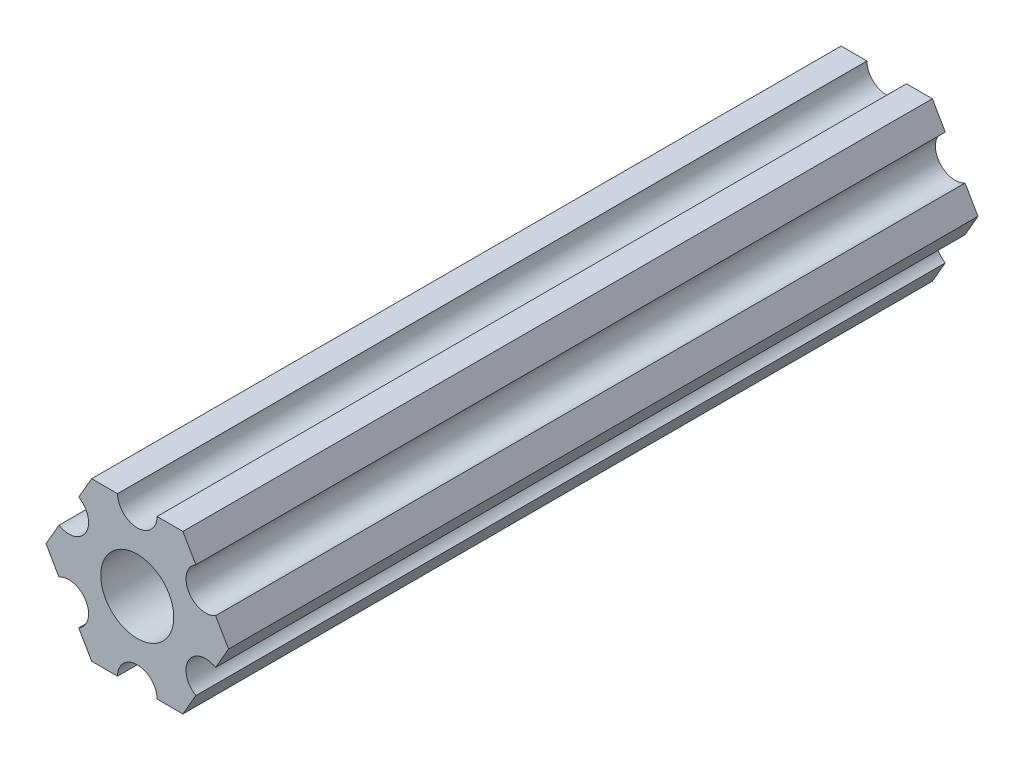
ISO-10303-21;
HEADER;
FILE_DESCRIPTION(('STEP AP214'),'2;1');
FILE_NAME('part.step','',(''),(''),'','','');
FILE_SCHEMA(('AUTOMOTIVE_DESIGN { 1 0 10303 214 1 1 1 1 }'));
ENDSEC;
DATA;
#1=APPLICATION_CONTEXT('core data for automotive mechanical design processes');
#2=APPLICATION_PROTOCOL_DEFINITION('international standard','automotive_design',2000,#1);
#3=PRODUCT_CONTEXT('',#1,'mechanical');
#4=PRODUCT('Part','Part','',(#3));
#5=PRODUCT_RELATED_PRODUCT_CATEGORY('part','',(#4));
#6=PRODUCT_DEFINITION_FORMATION('','',#4);
#7=PRODUCT_DEFINITION_CONTEXT('part definition',#1,'design');
#8=PRODUCT_DEFINITION('design','',#6,#7);
#9=PRODUCT_DEFINITION_SHAPE('','',#8);
#10=(LENGTH_UNIT() NAMED_UNIT(*) SI_UNIT(.MILLI.,.METRE.));
#11=(NAMED_UNIT(*) PLANE_ANGLE_UNIT() SI_UNIT($,.RADIAN.));
#12=(NAMED_UNIT(*) SI_UNIT($,.STERADIAN.) SOLID_ANGLE_UNIT());
#13=UNCERTAINTY_MEASURE_WITH_UNIT(LENGTH_MEASURE(1.E-05),#10,'distance_accuracy_value','');
#14=(GEOMETRIC_REPRESENTATION_CONTEXT(3) GLOBAL_UNCERTAINTY_ASSIGNED_CONTEXT((#13)) GLOBAL_UNIT_ASSIGNED_CONTEXT((#10,
#11,#12)) REPRESENTATION_CONTEXT('',''));
#15=CARTESIAN_POINT('',(0.,0.,0.));
#16=DIRECTION('',(0.,0.,1.));
#17=DIRECTION('',(1.,0.,0.));
#18=AXIS2_PLACEMENT_3D('',#15,#16,#17);
#19=CARTESIAN_POINT('',(6.29301142309098,-1.80018429024546,85.725));
#20=DIRECTION('',(-0.866025434075723,0.499999947533953,0.));
#21=DIRECTION('',(0.,0.,1.));
#22=AXIS2_PLACEMENT_3D('',#19,#20,#21);
#23=PLANE('',#22);
#24=DIRECTION('',(-0.499999947533953,-0.866025434075723,0.));
#25=VECTOR('',#24,1.);
#26=CARTESIAN_POINT('',(7.33234841870826,4.44212518961143E-07,25.527));
#27=LINE('',#26,#25);
#28=CARTESIAN_POINT('',(7.33234841870826,4.44212518961143E-07,25.527));
#29=VERTEX_POINT('',#28);
#30=CARTESIAN_POINT('',(6.29301142309098,-1.80018429024546,25.527));
#31=VERTEX_POINT('',#30);
#32=EDGE_CURVE('E65',#29,#31,#27,.T.);
#33=ORIENTED_EDGE('',*,*,#32,.F.);
#34=DIRECTION('',(0.,0.,1.));
#35=VECTOR('',#34,1.);
#36=CARTESIAN_POINT('',(7.33234841870827,4.44212519169686E-07,85.725));
#37=LINE('',#36,#35);
#38=CARTESIAN_POINT('',(7.33234841870826,4.44212519315656E-07,85.725));
#39=VERTEX_POINT('',#38);
#40=EDGE_CURVE('E11',#29,#39,#37,.T.);
#41=ORIENTED_EDGE('',*,*,#40,.T.);
#42=DIRECTION('',(0.499999947533953,0.866025434075723,0.));
#43=VECTOR('',#42,1.);
#44=CARTESIAN_POINT('',(6.29301142309098,-1.80018429024546,85.725));
#45=LINE('',#44,#43);
#46=CARTESIAN_POINT('',(6.29301142309098,-1.80018429024546,85.725));
#47=VERTEX_POINT('',#46);
#48=EDGE_CURVE('E311',#47,#39,#45,.T.);
#49=ORIENTED_EDGE('',*,*,#48,.F.);
#50=DIRECTION('',(0.,0.,-1.));
#51=VECTOR('',#50,1.);
#52=CARTESIAN_POINT('',(6.29301142309098,-1.80018429024546,85.725));
#53=LINE('',#52,#51);
#54=EDGE_CURVE('E322',#47,#31,#53,.T.);
#55=ORIENTED_EDGE('',*,*,#54,.T.);
#56=EDGE_LOOP('',(#33,#41,#49,#55));
#57=FACE_BOUND('',#56,.T.);
#58=ADVANCED_FACE('F49',(#57),#23,.F.);
#59=CARTESIAN_POINT('',(7.33234841870827,4.44212519169686E-07,85.725));
#60=DIRECTION('',(-0.866025373493145,-0.500000052466057,0.));
#61=DIRECTION('',(-0.500000052466057,0.866025373493145,0.));
#62=AXIS2_PLACEMENT_3D('',#59,#60,#61);
#63=PLANE('',#62);
#64=DIRECTION('',(0.500000052466055,-0.866025373493145,0.));
#65=VECTOR('',#64,1.);
#66=CARTESIAN_POINT('',(6.29301120497139,1.80018505273894,25.527));
#67=LINE('',#66,#65);
#68=CARTESIAN_POINT('',(6.29301120497139,1.80018505273894,25.527));
#69=VERTEX_POINT('',#68);
#70=EDGE_CURVE('E199',#69,#29,#67,.T.);
#71=ORIENTED_EDGE('',*,*,#70,.F.);
#72=DIRECTION('',(0.,0.,1.));
#73=VECTOR('',#72,1.);
#74=CARTESIAN_POINT('',(6.29301120497139,1.80018505273894,85.725));
#75=LINE('',#74,#73);
#76=CARTESIAN_POINT('',(6.29301120497139,1.80018505273894,85.725));
#77=VERTEX_POINT('',#76);
#78=EDGE_CURVE('E58',#69,#77,#75,.T.);
#79=ORIENTED_EDGE('',*,*,#78,.T.);
#80=DIRECTION('',(-0.500000052466057,0.866025373493145,0.));
#81=VECTOR('',#80,1.);
#82=CARTESIAN_POINT('',(7.33234841870827,4.44212519198906E-07,85.725));
#83=LINE('',#82,#81);
#84=EDGE_CURVE('E308',#39,#77,#83,.T.);
#85=ORIENTED_EDGE('',*,*,#84,.F.);
#86=ORIENTED_EDGE('',*,*,#40,.F.);
#87=EDGE_LOOP('',(#71,#79,#85,#86));
#88=FACE_BOUND('',#87,.T.);
#89=ADVANCED_FACE('F208',(#88),#63,.F.);
#90=CARTESIAN_POINT('',(4.70551103839172,4.54981561357972,85.725));
#91=DIRECTION('',(-0.866025373493151,-0.500000052466046,0.));
#92=DIRECTION('',(-0.500000052466046,0.866025373493151,0.));
#93=AXIS2_PLACEMENT_3D('',#90,#91,#92);
#94=PLANE('',#93);
#95=DIRECTION('',(0.500000052466045,-0.866025373493151,0.));
#96=VECTOR('',#95,1.);
#97=CARTESIAN_POINT('',(3.66617382465481,6.35000022210627,25.527));
#98=LINE('',#97,#96);
#99=CARTESIAN_POINT('',(3.66617382465481,6.35000022210627,25.527));
#100=VERTEX_POINT('',#99);
#101=CARTESIAN_POINT('',(4.70551103839172,4.54981561357972,25.527));
#102=VERTEX_POINT('',#101);
#103=EDGE_CURVE('E201',#100,#102,#98,.T.);
#104=ORIENTED_EDGE('',*,*,#103,.F.);
#105=DIRECTION('',(0.,0.,1.));
#106=VECTOR('',#105,1.);
#107=CARTESIAN_POINT('',(3.66617382465481,6.35000022210627,85.725));
#108=LINE('',#107,#106);
#109=CARTESIAN_POINT('',(3.66617382465481,6.35000022210627,85.725));
#110=VERTEX_POINT('',#109);
#111=EDGE_CURVE('E217',#100,#110,#108,.T.);
#112=ORIENTED_EDGE('',*,*,#111,.T.);
#113=DIRECTION('',(-0.500000052466046,0.866025373493151,0.));
#114=VECTOR('',#113,1.);
#115=CARTESIAN_POINT('',(4.70551103839172,4.54981561357972,85.725));
#116=LINE('',#115,#114);
#117=CARTESIAN_POINT('',(4.70551103839172,4.54981561357972,85.725));
#118=VERTEX_POINT('',#117);
#119=EDGE_CURVE('E304',#118,#110,#116,.T.);
#120=ORIENTED_EDGE('',*,*,#119,.F.);
#121=DIRECTION('',(0.,0.,1.));
#122=VECTOR('',#121,1.);
#123=CARTESIAN_POINT('',(4.70551103839172,4.54981561357972,85.725));
#124=LINE('',#123,#122);
#125=EDGE_CURVE('E318',#102,#118,#124,.T.);
#126=ORIENTED_EDGE('',*,*,#125,.F.);
#127=EDGE_LOOP('',(#104,#112,#120,#126));
#128=FACE_BOUND('',#127,.T.);
#129=ADVANCED_FACE('F440',(#128),#94,.F.);
#130=CARTESIAN_POINT('',(3.66617382465481,6.35000022210627,85.725));
#131=DIRECTION('',(6.05825850611185E-08,-1.,0.));
#132=DIRECTION('',(0.,0.,-1.));
#133=AXIS2_PLACEMENT_3D('',#130,#131,#132);
#134=PLANE('',#133);
#135=DIRECTION('',(1.,3.02912931564594E-08,0.));
#136=VECTOR('',#135,1.);
#137=CARTESIAN_POINT('',(1.58749961530073,6.35000015914054,25.527));
#138=LINE('',#137,#136);
#139=CARTESIAN_POINT('',(1.58749961530073,6.35000015914054,25.527));
#140=VERTEX_POINT('',#139);
#141=EDGE_CURVE('E344',#140,#100,#138,.T.);
#142=ORIENTED_EDGE('',*,*,#141,.F.);
#143=DIRECTION('',(0.,0.,1.));
#144=VECTOR('',#143,1.);
#145=CARTESIAN_POINT('',(1.58749961530074,6.35000009617482,85.725));
#146=LINE('',#145,#144);
#147=CARTESIAN_POINT('',(1.58749961530073,6.35000015914054,85.725));
#148=VERTEX_POINT('',#147);
#149=EDGE_CURVE('E223',#140,#148,#146,.T.);
#150=ORIENTED_EDGE('',*,*,#149,.T.);
#151=DIRECTION('',(-1.,0.,0.));
#152=VECTOR('',#151,1.);
#153=CARTESIAN_POINT('',(5.49926112168156,6.35000022210627,85.725));
#154=LINE('',#153,#152);
#155=EDGE_CURVE('E300',#110,#148,#154,.T.);
#156=ORIENTED_EDGE('',*,*,#155,.F.);
#157=ORIENTED_EDGE('',*,*,#111,.F.);
#158=EDGE_LOOP('',(#142,#150,#156,#157));
#159=FACE_BOUND('',#158,.T.);
#160=ADVANCED_FACE('F436',(#159),#134,.F.);
#161=CARTESIAN_POINT('',(-3.84699260060323E-07,6.35,85.725));
#162=DIRECTION('',(0.,0.,-1.));
#163=DIRECTION('',(-1.,0.,0.));
#164=AXIS2_PLACEMENT_3D('',#161,#162,#163);
#165=CYLINDRICAL_SURFACE('',#164,1.5875);
#166=CARTESIAN_POINT('',(-3.84699260060323E-07,6.35,25.527));
#167=DIRECTION('',(0.,0.,1.));
#168=DIRECTION('',(-1.,0.,0.));
#169=AXIS2_PLACEMENT_3D('',#166,#167,#168);
#170=CIRCLE('',#169,1.5875);
#171=CARTESIAN_POINT('',(-1.58750038469926,6.34999990382519,25.527));
#172=VERTEX_POINT('',#171);
#173=EDGE_CURVE('E346',#172,#140,#170,.T.);
#174=ORIENTED_EDGE('',*,*,#173,.F.);
#175=DIRECTION('',(0.,0.,1.));
#176=VECTOR('',#175,1.);
#177=CARTESIAN_POINT('',(-1.58750038469926,6.34999990382518,85.725));
#178=LINE('',#177,#176);
#179=CARTESIAN_POINT('',(-1.58750038469926,6.34999990382519,85.725));
#180=VERTEX_POINT('',#179);
#181=EDGE_CURVE('E228',#172,#180,#178,.T.);
#182=ORIENTED_EDGE('',*,*,#181,.T.);
#183=CARTESIAN_POINT('',(-3.84699260060323E-07,6.35,85.725));
#184=DIRECTION('',(0.,0.,-1.));
#185=DIRECTION('',(-1.,0.,0.));
#186=AXIS2_PLACEMENT_3D('',#183,#184,#185);
#187=CIRCLE('',#186,1.5875);
#188=EDGE_CURVE('E296',#148,#180,#187,.T.);
#189=ORIENTED_EDGE('',*,*,#188,.F.);
#190=ORIENTED_EDGE('',*,*,#149,.F.);
#191=EDGE_LOOP('',(#174,#182,#189,#190));
#192=FACE_BOUND('',#191,.T.);
#193=ADVANCED_FACE('F431',(#192),#165,.F.);
#194=CARTESIAN_POINT('',(-1.58750038469926,6.34999990382518,85.725));
#195=DIRECTION('',(6.05825963273174E-08,-1.,0.));
#196=DIRECTION('',(0.,0.,-1.));
#197=AXIS2_PLACEMENT_3D('',#194,#195,#196);
#198=PLANE('',#197);
#199=DIRECTION('',(1.,2.01941985512212E-08,0.));
#200=VECTOR('',#199,1.);
#201=CARTESIAN_POINT('',(-3.66617454558244,6.34999986184803,25.527));
#202=LINE('',#201,#200);
#203=CARTESIAN_POINT('',(-3.66617454558244,6.34999986184803,25.527));
#204=VERTEX_POINT('',#203);
#205=EDGE_CURVE('E348',#204,#172,#202,.T.);
#206=ORIENTED_EDGE('',*,*,#205,.F.);
#207=DIRECTION('',(0.,0.,1.));
#208=VECTOR('',#207,1.);
#209=CARTESIAN_POINT('',(-3.66617459405349,6.3499997778937,85.725));
#210=LINE('',#209,#208);
#211=CARTESIAN_POINT('',(-3.66617454558244,6.34999986184803,85.725));
#212=VERTEX_POINT('',#211);
#213=EDGE_CURVE('E229',#204,#212,#210,.T.);
#214=ORIENTED_EDGE('',*,*,#213,.T.);
#215=DIRECTION('',(-1.,0.,0.));
#216=VECTOR('',#215,1.);
#217=CARTESIAN_POINT('',(5.49926112168156,6.34999990382519,85.725));
#218=LINE('',#217,#216);
#219=EDGE_CURVE('E289',#180,#212,#218,.T.);
#220=ORIENTED_EDGE('',*,*,#219,.F.);
#221=ORIENTED_EDGE('',*,*,#181,.F.);
#222=EDGE_LOOP('',(#206,#214,#220,#221));
#223=FACE_BOUND('',#222,.T.);
#224=ADVANCED_FACE('F427',(#223),#198,.F.);
#225=CARTESIAN_POINT('',(-3.66617459405349,6.3499997778937,85.725));
#226=DIRECTION('',(0.866025434075729,-0.499999947533942,0.));
#227=DIRECTION('',(0.,0.,-1.));
#228=AXIS2_PLACEMENT_3D('',#225,#226,#227);
#229=PLANE('',#228);
#230=DIRECTION('',(0.499999947533939,0.866025434075731,0.));
#231=VECTOR('',#230,1.);
#232=CARTESIAN_POINT('',(-4.70551158967065,4.54981504343587,25.527));
#233=LINE('',#232,#231);
#234=CARTESIAN_POINT('',(-4.70551158967065,4.54981504343587,25.527));
#235=VERTEX_POINT('',#234);
#236=EDGE_CURVE('E350',#235,#204,#233,.T.);
#237=ORIENTED_EDGE('',*,*,#236,.F.);
#238=DIRECTION('',(0.,0.,1.));
#239=VECTOR('',#238,1.);
#240=CARTESIAN_POINT('',(-4.70551158967065,4.54981504343587,85.725));
#241=LINE('',#240,#239);
#242=CARTESIAN_POINT('',(-4.70551158967065,4.54981504343587,85.725));
#243=VERTEX_POINT('',#242);
#244=EDGE_CURVE('E232',#235,#243,#241,.T.);
#245=ORIENTED_EDGE('',*,*,#244,.T.);
#246=DIRECTION('',(-0.499999947533943,-0.866025434075729,0.));
#247=VECTOR('',#246,1.);
#248=CARTESIAN_POINT('',(-3.66617459405349,6.3499997778937,85.725));
#249=LINE('',#248,#247);
#250=EDGE_CURVE('E285',#212,#243,#249,.T.);
#251=ORIENTED_EDGE('',*,*,#250,.F.);
#252=ORIENTED_EDGE('',*,*,#213,.F.);
#253=EDGE_LOOP('',(#237,#245,#251,#252));
#254=FACE_BOUND('',#253,.T.);
#255=ADVANCED_FACE('F421',(#254),#229,.F.);
#256=CARTESIAN_POINT('',(-5.49926150638082,3.17499966684067,85.725));
#257=DIRECTION('',(0.,0.,-1.));
#258=DIRECTION('',(-1.,0.,0.));
#259=AXIS2_PLACEMENT_3D('',#256,#257,#258);
#260=CYLINDRICAL_SURFACE('',#259,1.5875);
#261=CARTESIAN_POINT('',(-5.49926150638082,3.17499966684067,25.527));
#262=DIRECTION('',(0.,0.,1.));
#263=DIRECTION('',(-1.,0.,0.));
#264=AXIS2_PLACEMENT_3D('',#261,#262,#263);
#265=CIRCLE('',#264,1.5875);
#266=CARTESIAN_POINT('',(-6.29301142309098,1.80018429024546,25.527));
#267=VERTEX_POINT('',#266);
#268=EDGE_CURVE('E352',#267,#235,#265,.T.);
#269=ORIENTED_EDGE('',*,*,#268,.F.);
#270=DIRECTION('',(0.,0.,1.));
#271=VECTOR('',#270,1.);
#272=CARTESIAN_POINT('',(-6.29301142309098,1.80018429024547,85.725));
#273=LINE('',#272,#271);
#274=CARTESIAN_POINT('',(-6.29301142309098,1.80018429024547,85.725));
#275=VERTEX_POINT('',#274);
#276=EDGE_CURVE('E233',#267,#275,#273,.T.);
#277=ORIENTED_EDGE('',*,*,#276,.T.);
#278=CARTESIAN_POINT('',(-5.49926150638082,3.17499966684067,85.725));
#279=DIRECTION('',(0.,0.,-1.));
#280=DIRECTION('',(-1.,0.,0.));
#281=AXIS2_PLACEMENT_3D('',#278,#279,#280);
#282=CIRCLE('',#281,1.5875);
#283=EDGE_CURVE('E281',#243,#275,#282,.T.);
#284=ORIENTED_EDGE('',*,*,#283,.F.);
#285=ORIENTED_EDGE('',*,*,#244,.F.);
#286=EDGE_LOOP('',(#269,#277,#284,#285));
#287=FACE_BOUND('',#286,.T.);
#288=ADVANCED_FACE('F417',(#287),#260,.F.);
#289=CARTESIAN_POINT('',(-6.29301142309098,1.80018429024547,85.725));
#290=DIRECTION('',(0.866025434075724,-0.499999947533952,0.));
#291=DIRECTION('',(0.,0.,-1.));
#292=AXIS2_PLACEMENT_3D('',#289,#290,#291);
#293=PLANE('',#292);
#294=DIRECTION('',(0.499999947533951,0.866025434075724,0.));
#295=VECTOR('',#294,1.);
#296=CARTESIAN_POINT('',(-7.33234841870826,-4.44212524036367E-07,25.527));
#297=LINE('',#296,#295);
#298=CARTESIAN_POINT('',(-7.33234841870826,-4.44212524036367E-07,25.527));
#299=VERTEX_POINT('',#298);
#300=EDGE_CURVE('E354',#299,#267,#297,.T.);
#301=ORIENTED_EDGE('',*,*,#300,.F.);
#302=DIRECTION('',(0.,0.,1.));
#303=VECTOR('',#302,1.);
#304=CARTESIAN_POINT('',(-7.33234841870827,-4.44212523790841E-07,85.725));
#305=LINE('',#304,#303);
#306=CARTESIAN_POINT('',(-7.33234841870826,-4.44212524036367E-07,85.725));
#307=VERTEX_POINT('',#306);
#308=EDGE_CURVE('E236',#299,#307,#305,.T.);
#309=ORIENTED_EDGE('',*,*,#308,.T.);
#310=DIRECTION('',(-0.499999947533952,-0.866025434075724,0.));
#311=VECTOR('',#310,1.);
#312=CARTESIAN_POINT('',(-6.29301142309098,1.80018429024547,85.725));
#313=LINE('',#312,#311);
#314=EDGE_CURVE('E277',#275,#307,#313,.T.);
#315=ORIENTED_EDGE('',*,*,#314,.F.);
#316=ORIENTED_EDGE('',*,*,#276,.F.);
#317=EDGE_LOOP('',(#301,#309,#315,#316));
#318=FACE_BOUND('',#317,.T.);
#319=ADVANCED_FACE('F411',(#318),#293,.F.);
#320=CARTESIAN_POINT('',(-7.33234841870827,-4.44212523790841E-07,85.725));
#321=DIRECTION('',(0.866025373493151,0.500000052466045,0.));
#322=DIRECTION('',(0.,0.,-1.));
#323=AXIS2_PLACEMENT_3D('',#320,#321,#322);
#324=PLANE('',#323);
#325=DIRECTION('',(-0.500000052466045,0.866025373493152,0.));
#326=VECTOR('',#325,1.);
#327=CARTESIAN_POINT('',(-6.29301120497141,-1.80018505273897,25.527));
#328=LINE('',#327,#326);
#329=CARTESIAN_POINT('',(-6.29301120497141,-1.80018505273896,25.527));
#330=VERTEX_POINT('',#329);
#331=EDGE_CURVE('E356',#330,#299,#328,.T.);
#332=ORIENTED_EDGE('',*,*,#331,.F.);
#333=DIRECTION('',(0.,0.,1.));
#334=VECTOR('',#333,1.);
#335=CARTESIAN_POINT('',(-6.29301120497141,-1.80018505273897,85.725));
#336=LINE('',#335,#334);
#337=CARTESIAN_POINT('',(-6.29301120497141,-1.80018505273897,85.725));
#338=VERTEX_POINT('',#337);
#339=EDGE_CURVE('E254',#330,#338,#336,.T.);
#340=ORIENTED_EDGE('',*,*,#339,.T.);
#341=DIRECTION('',(0.500000052466045,-0.866025373493151,0.));
#342=VECTOR('',#341,1.);
#343=CARTESIAN_POINT('',(-7.33234841870827,-4.44212523969395E-07,85.725));
#344=LINE('',#343,#342);
#345=EDGE_CURVE('E276',#307,#338,#344,.T.);
#346=ORIENTED_EDGE('',*,*,#345,.F.);
#347=ORIENTED_EDGE('',*,*,#308,.F.);
#348=EDGE_LOOP('',(#332,#340,#346,#347));
#349=FACE_BOUND('',#348,.T.);
#350=ADVANCED_FACE('F407',(#349),#324,.F.);
#351=CARTESIAN_POINT('',(-5.49926112168156,-3.17500033315934,85.725));
#352=DIRECTION('',(0.,0.,-1.));
#353=DIRECTION('',(-1.,0.,0.));
#354=AXIS2_PLACEMENT_3D('',#351,#352,#353);
#355=CYLINDRICAL_SURFACE('',#354,1.5875);
#356=CARTESIAN_POINT('',(-5.49926112168156,-3.17500033315934,25.527));
#357=DIRECTION('',(0.,0.,1.));
#358=DIRECTION('',(-1.,0.,0.));
#359=AXIS2_PLACEMENT_3D('',#356,#357,#358);
#360=CIRCLE('',#359,1.5875);
#361=CARTESIAN_POINT('',(-4.70551103839172,-4.54981561357971,25.527));
#362=VERTEX_POINT('',#361);
#363=EDGE_CURVE('E358',#362,#330,#360,.T.);
#364=ORIENTED_EDGE('',*,*,#363,.F.);
#365=DIRECTION('',(0.,0.,1.));
#366=VECTOR('',#365,1.);
#367=CARTESIAN_POINT('',(-4.70551103839172,-4.54981561357972,85.725));
#368=LINE('',#367,#366);
#369=CARTESIAN_POINT('',(-4.70551103839172,-4.54981561357972,85.725));
#370=VERTEX_POINT('',#369);
#371=EDGE_CURVE('E243',#362,#370,#368,.T.);
#372=ORIENTED_EDGE('',*,*,#371,.T.);
#373=CARTESIAN_POINT('',(-5.49926112168156,-3.17500033315934,85.725));
#374=DIRECTION('',(0.,0.,-1.));
#375=DIRECTION('',(-1.,0.,0.));
#376=AXIS2_PLACEMENT_3D('',#373,#374,#375);
#377=CIRCLE('',#376,1.5875);
#378=EDGE_CURVE('E272',#338,#370,#377,.T.);
#379=ORIENTED_EDGE('',*,*,#378,.F.);
#380=ORIENTED_EDGE('',*,*,#339,.F.);
#381=EDGE_LOOP('',(#364,#372,#379,#380));
#382=FACE_BOUND('',#381,.T.);
#383=ADVANCED_FACE('F401',(#382),#355,.F.);
#384=CARTESIAN_POINT('',(-4.70551103839172,-4.54981561357972,85.725));
#385=DIRECTION('',(0.866025373493152,0.500000052466045,0.));
#386=DIRECTION('',(0.,0.,-1.));
#387=AXIS2_PLACEMENT_3D('',#384,#385,#386);
#388=PLANE('',#387);
#389=DIRECTION('',(-0.500000052466043,0.866025373493152,0.));
#390=VECTOR('',#389,1.);
#391=CARTESIAN_POINT('',(-3.66617382465481,-6.35000022210628,25.527));
#392=LINE('',#391,#390);
#393=CARTESIAN_POINT('',(-3.66617382465481,-6.35000022210628,25.527));
#394=VERTEX_POINT('',#393);
#395=EDGE_CURVE('E360',#394,#362,#392,.T.);
#396=ORIENTED_EDGE('',*,*,#395,.F.);
#397=DIRECTION('',(0.,0.,1.));
#398=VECTOR('',#397,1.);
#399=CARTESIAN_POINT('',(-3.66617382465481,-6.35000022210628,85.725));
#400=LINE('',#399,#398);
#401=CARTESIAN_POINT('',(-3.66617382465481,-6.35000022210628,85.725));
#402=VERTEX_POINT('',#401);
#403=EDGE_CURVE('E240',#394,#402,#400,.T.);
#404=ORIENTED_EDGE('',*,*,#403,.T.);
#405=DIRECTION('',(0.500000052466045,-0.866025373493151,0.));
#406=VECTOR('',#405,1.);
#407=CARTESIAN_POINT('',(-4.70551103839172,-4.54981561357972,85.725));
#408=LINE('',#407,#406);
#409=EDGE_CURVE('E268',#370,#402,#408,.T.);
#410=ORIENTED_EDGE('',*,*,#409,.F.);
#411=ORIENTED_EDGE('',*,*,#371,.F.);
#412=EDGE_LOOP('',(#396,#404,#410,#411));
#413=FACE_BOUND('',#412,.T.);
#414=ADVANCED_FACE('F397',(#413),#388,.F.);
#415=CARTESIAN_POINT('',(-3.66617382465481,-6.35000022210628,85.725));
#416=DIRECTION('',(-6.05825854783851E-08,1.,0.));
#417=DIRECTION('',(0.,0.,1.));
#418=AXIS2_PLACEMENT_3D('',#415,#416,#417);
#419=PLANE('',#418);
#420=DIRECTION('',(-0.999999999999999,-5.34249856349036E-08,0.));
#421=VECTOR('',#420,1.);
#422=CARTESIAN_POINT('',(-1.58749961530073,-6.35000011105314,25.527));
#423=LINE('',#422,#421);
#424=CARTESIAN_POINT('',(-1.58749961530073,-6.35000011105314,25.527));
#425=VERTEX_POINT('',#424);
#426=EDGE_CURVE('E362',#425,#394,#423,.T.);
#427=ORIENTED_EDGE('',*,*,#426,.F.);
#428=DIRECTION('',(0.,0.,1.));
#429=VECTOR('',#428,1.);
#430=CARTESIAN_POINT('',(-1.58749961530074,-6.35,85.725));
#431=LINE('',#430,#429);
#432=CARTESIAN_POINT('',(-1.58749961530073,-6.35000011105314,85.725));
#433=VERTEX_POINT('',#432);
#434=EDGE_CURVE('E237',#425,#433,#431,.T.);
#435=ORIENTED_EDGE('',*,*,#434,.T.);
#436=DIRECTION('',(1.,0.,0.));
#437=VECTOR('',#436,1.);
#438=CARTESIAN_POINT('',(5.49926112168156,-6.35000022210628,85.725));
#439=LINE('',#438,#437);
#440=EDGE_CURVE('E262',#402,#433,#439,.T.);
#441=ORIENTED_EDGE('',*,*,#440,.F.);
#442=ORIENTED_EDGE('',*,*,#403,.F.);
#443=EDGE_LOOP('',(#427,#435,#441,#442));
#444=FACE_BOUND('',#443,.T.);
#445=ADVANCED_FACE('F391',(#444),#419,.F.);
#446=CARTESIAN_POINT('',(3.8469926204343E-07,-6.35,85.725));
#447=DIRECTION('',(0.,0.,-1.));
#448=DIRECTION('',(-1.,0.,0.));
#449=AXIS2_PLACEMENT_3D('',#446,#447,#448);
#450=CYLINDRICAL_SURFACE('',#449,1.5875);
#451=CARTESIAN_POINT('',(3.8469926204343E-07,-6.35,25.527));
#452=DIRECTION('',(0.,0.,1.));
#453=DIRECTION('',(-1.,0.,0.));
#454=AXIS2_PLACEMENT_3D('',#451,#452,#453);
#455=CIRCLE('',#454,1.5875);
#456=CARTESIAN_POINT('',(1.58750038469926,-6.34999990382519,25.527));
#457=VERTEX_POINT('',#456);
#458=EDGE_CURVE('E364',#457,#425,#455,.T.);
#459=ORIENTED_EDGE('',*,*,#458,.F.);
#460=DIRECTION('',(0.,0.,1.));
#461=VECTOR('',#460,1.);
#462=CARTESIAN_POINT('',(1.58750038469926,-6.34999990382518,85.725));
#463=LINE('',#462,#461);
#464=CARTESIAN_POINT('',(1.58750038469926,-6.34999990382519,85.725));
#465=VERTEX_POINT('',#464);
#466=EDGE_CURVE('E78',#457,#465,#463,.T.);
#467=ORIENTED_EDGE('',*,*,#466,.T.);
#468=CARTESIAN_POINT('',(3.8469926204343E-07,-6.35,85.725));
#469=DIRECTION('',(0.,0.,-1.));
#470=DIRECTION('',(-1.,0.,0.));
#471=AXIS2_PLACEMENT_3D('',#468,#469,#470);
#472=CIRCLE('',#471,1.5875);
#473=EDGE_CURVE('E258',#433,#465,#472,.T.);
#474=ORIENTED_EDGE('',*,*,#473,.F.);
#475=ORIENTED_EDGE('',*,*,#434,.F.);
#476=EDGE_LOOP('',(#459,#467,#474,#475));
#477=FACE_BOUND('',#476,.T.);
#478=ADVANCED_FACE('F388',(#477),#450,.F.);
#479=CARTESIAN_POINT('',(1.58750038469926,-6.34999990382518,85.725));
#480=DIRECTION('',(-6.05825721258438E-08,1.,0.));
#481=DIRECTION('',(0.,0.,1.));
#482=AXIS2_PLACEMENT_3D('',#479,#480,#481);
#483=PLANE('',#482);
#484=DIRECTION('',(-1.,-2.01941939612863E-08,0.));
#485=VECTOR('',#484,1.);
#486=CARTESIAN_POINT('',(3.66617454558244,-6.34999986184804,25.527));
#487=LINE('',#486,#485);
#488=CARTESIAN_POINT('',(3.66617454558244,-6.34999986184804,25.527));
#489=VERTEX_POINT('',#488);
#490=EDGE_CURVE('E366',#489,#457,#487,.T.);
#491=ORIENTED_EDGE('',*,*,#490,.F.);
#492=DIRECTION('',(0.,0.,1.));
#493=VECTOR('',#492,1.);
#494=CARTESIAN_POINT('',(3.66617459405346,-6.34999977789375,85.725));
#495=LINE('',#494,#493);
#496=CARTESIAN_POINT('',(3.66617454558244,-6.34999986184804,85.725));
#497=VERTEX_POINT('',#496);
#498=EDGE_CURVE('E246',#489,#497,#495,.T.);
#499=ORIENTED_EDGE('',*,*,#498,.T.);
#500=DIRECTION('',(1.,0.,0.));
#501=VECTOR('',#500,1.);
#502=CARTESIAN_POINT('',(5.49926112168156,-6.34999990382519,85.725));
#503=LINE('',#502,#501);
#504=EDGE_CURVE('E251',#465,#497,#503,.T.);
#505=ORIENTED_EDGE('',*,*,#504,.F.);
#506=ORIENTED_EDGE('',*,*,#466,.F.);
#507=EDGE_LOOP('',(#491,#499,#505,#506));
#508=FACE_BOUND('',#507,.T.);
#509=ADVANCED_FACE('F385',(#508),#483,.F.);
#510=CARTESIAN_POINT('',(3.66617459405346,-6.34999977789375,85.725));
#511=DIRECTION('',(-0.86602543407573,0.499999947533941,0.));
#512=DIRECTION('',(0.,0.,1.));
#513=AXIS2_PLACEMENT_3D('',#510,#511,#512);
#514=PLANE('',#513);
#515=DIRECTION('',(-0.499999947533941,-0.86602543407573,0.));
#516=VECTOR('',#515,1.);
#517=CARTESIAN_POINT('',(4.70551158967065,-4.54981504343587,25.527));
#518=LINE('',#517,#516);
#519=CARTESIAN_POINT('',(4.70551158967065,-4.54981504343587,25.527));
#520=VERTEX_POINT('',#519);
#521=EDGE_CURVE('E368',#520,#489,#518,.T.);
#522=ORIENTED_EDGE('',*,*,#521,.F.);
#523=DIRECTION('',(0.,0.,-1.));
#524=VECTOR('',#523,1.);
#525=CARTESIAN_POINT('',(4.70551158967065,-4.54981504343587,85.725));
#526=LINE('',#525,#524);
#527=CARTESIAN_POINT('',(4.70551158967065,-4.54981504343587,85.725));
#528=VERTEX_POINT('',#527);
#529=EDGE_CURVE('E247',#528,#520,#526,.T.);
#530=ORIENTED_EDGE('',*,*,#529,.F.);
#531=DIRECTION('',(0.49999994753394,0.86602543407573,0.));
#532=VECTOR('',#531,1.);
#533=CARTESIAN_POINT('',(3.66617459405346,-6.34999977789376,85.725));
#534=LINE('',#533,#532);
#535=EDGE_CURVE('E314',#497,#528,#534,.T.);
#536=ORIENTED_EDGE('',*,*,#535,.F.);
#537=ORIENTED_EDGE('',*,*,#498,.F.);
#538=EDGE_LOOP('',(#522,#530,#536,#537));
#539=FACE_BOUND('',#538,.T.);
#540=ADVANCED_FACE('F379',(#539),#514,.F.);
#541=CARTESIAN_POINT('',(5.49926112168156,3.17500033315934,85.725));
#542=DIRECTION('',(0.,0.,-1.));
#543=DIRECTION('',(-1.,0.,0.));
#544=AXIS2_PLACEMENT_3D('',#541,#542,#543);
#545=CYLINDRICAL_SURFACE('',#544,1.5875);
#546=CARTESIAN_POINT('',(5.49926112168156,3.17500033315934,25.527));
#547=DIRECTION('',(0.,0.,1.));
#548=DIRECTION('',(-1.,0.,0.));
#549=AXIS2_PLACEMENT_3D('',#546,#547,#548);
#550=CIRCLE('',#549,1.5875);
#551=EDGE_CURVE('E195',#102,#69,#550,.T.);
#552=ORIENTED_EDGE('',*,*,#551,.F.);
#553=ORIENTED_EDGE('',*,*,#125,.T.);
#554=CARTESIAN_POINT('',(5.49926112168156,3.17500033315934,85.725));
#555=DIRECTION('',(0.,0.,-1.));
#556=DIRECTION('',(-1.,0.,0.));
#557=AXIS2_PLACEMENT_3D('',#554,#555,#556);
#558=CIRCLE('',#557,1.5875);
#559=EDGE_CURVE('E214',#77,#118,#558,.T.);
#560=ORIENTED_EDGE('',*,*,#559,.F.);
#561=ORIENTED_EDGE('',*,*,#78,.F.);
#562=EDGE_LOOP('',(#552,#553,#560,#561));
#563=FACE_BOUND('',#562,.T.);
#564=ADVANCED_FACE('F212',(#563),#545,.F.);
#565=CARTESIAN_POINT('',(5.49926150638082,-3.17499966684067,85.725));
#566=DIRECTION('',(0.,0.,-1.));
#567=DIRECTION('',(-1.,0.,0.));
#568=AXIS2_PLACEMENT_3D('',#565,#566,#567);
#569=CYLINDRICAL_SURFACE('',#568,1.5875);
#570=CARTESIAN_POINT('',(5.49926150638082,-3.17499966684067,25.527));
#571=DIRECTION('',(0.,0.,1.));
#572=DIRECTION('',(-1.,0.,0.));
#573=AXIS2_PLACEMENT_3D('',#570,#571,#572);
#574=CIRCLE('',#573,1.5875);
#575=EDGE_CURVE('E370',#31,#520,#574,.T.);
#576=ORIENTED_EDGE('',*,*,#575,.F.);
#577=ORIENTED_EDGE('',*,*,#54,.F.);
#578=CARTESIAN_POINT('',(5.49926150638082,-3.17499966684067,85.725));
#579=DIRECTION('',(0.,0.,-1.));
#580=DIRECTION('',(-1.,0.,0.));
#581=AXIS2_PLACEMENT_3D('',#578,#579,#580);
#582=CIRCLE('',#581,1.5875);
#583=EDGE_CURVE('E326',#528,#47,#582,.T.);
#584=ORIENTED_EDGE('',*,*,#583,.F.);
#585=ORIENTED_EDGE('',*,*,#529,.T.);
#586=EDGE_LOOP('',(#576,#577,#584,#585));
#587=FACE_BOUND('',#586,.T.);
#588=ADVANCED_FACE('F381',(#587),#569,.F.);
#589=CARTESIAN_POINT('',(0.,0.,85.725));
#590=DIRECTION('',(0.,0.,-1.));
#591=DIRECTION('',(-1.,0.,0.));
#592=AXIS2_PLACEMENT_3D('',#589,#590,#591);
#593=CYLINDRICAL_SURFACE('',#592,2.9337);
#594=CARTESIAN_POINT('',(0.,0.,85.725));
#595=DIRECTION('',(0.,0.,-1.));
#596=DIRECTION('',(-1.,0.,0.));
#597=AXIS2_PLACEMENT_3D('',#594,#595,#596);
#598=CIRCLE('',#597,2.9337);
#599=CARTESIAN_POINT('',(-2.9337,0.,85.725));
#600=VERTEX_POINT('',#599);
#601=EDGE_CURVE('E332',#600,#600,#598,.T.);
#602=ORIENTED_EDGE('',*,*,#601,.F.);
#603=EDGE_LOOP('',(#602));
#604=FACE_BOUND('',#603,.T.);
#605=CARTESIAN_POINT('',(0.,0.,25.527));
#606=DIRECTION('',(0.,0.,-1.));
#607=DIRECTION('',(-1.,0.,0.));
#608=AXIS2_PLACEMENT_3D('',#605,#606,#607);
#609=CIRCLE('',#608,2.9337);
#610=CARTESIAN_POINT('',(-2.9337,0.,25.527));
#611=VERTEX_POINT('',#610);
#612=EDGE_CURVE('E52',#611,#611,#609,.F.);
#613=ORIENTED_EDGE('',*,*,#612,.F.);
#614=EDGE_LOOP('',(#613));
#615=FACE_BOUND('',#614,.T.);
#616=ADVANCED_FACE('F594',(#604,#615),#593,.F.);
#617=CARTESIAN_POINT('',(5.49926112168156,3.17500033315934,85.725));
#618=DIRECTION('',(0.,0.,1.));
#619=DIRECTION('',(1.,0.,0.));
#620=AXIS2_PLACEMENT_3D('',#617,#618,#619);
#621=PLANE('',#620);
#622=ORIENTED_EDGE('',*,*,#601,.T.);
#623=EDGE_LOOP('',(#622));
#624=FACE_BOUND('',#623,.T.);
#625=ORIENTED_EDGE('',*,*,#535,.T.);
#626=ORIENTED_EDGE('',*,*,#583,.T.);
#627=ORIENTED_EDGE('',*,*,#48,.T.);
#628=ORIENTED_EDGE('',*,*,#84,.T.);
#629=ORIENTED_EDGE('',*,*,#559,.T.);
#630=ORIENTED_EDGE('',*,*,#119,.T.);
#631=ORIENTED_EDGE('',*,*,#155,.T.);
#632=ORIENTED_EDGE('',*,*,#188,.T.);
#633=ORIENTED_EDGE('',*,*,#219,.T.);
#634=ORIENTED_EDGE('',*,*,#250,.T.);
#635=ORIENTED_EDGE('',*,*,#283,.T.);
#636=ORIENTED_EDGE('',*,*,#314,.T.);
#637=ORIENTED_EDGE('',*,*,#345,.T.);
#638=ORIENTED_EDGE('',*,*,#378,.T.);
#639=ORIENTED_EDGE('',*,*,#409,.T.);
#640=ORIENTED_EDGE('',*,*,#440,.T.);
#641=ORIENTED_EDGE('',*,*,#473,.T.);
#642=ORIENTED_EDGE('',*,*,#504,.T.);
#643=EDGE_LOOP('',(#625,#626,#627,#628,#629,#630,#631,#632,#633,#634,#635,#636,#637,#638,#639,
#640,#641,#642));
#644=FACE_BOUND('',#643,.T.);
#645=ADVANCED_FACE('F383',(#624,#644),#621,.T.);
#646=CARTESIAN_POINT('',(5.49926112168156,3.17500033315934,25.527));
#647=DIRECTION('',(0.,0.,-1.));
#648=DIRECTION('',(-1.,0.,0.));
#649=AXIS2_PLACEMENT_3D('',#646,#647,#648);
#650=PLANE('',#649);
#651=ORIENTED_EDGE('',*,*,#551,.T.);
#652=ORIENTED_EDGE('',*,*,#70,.T.);
#653=ORIENTED_EDGE('',*,*,#32,.T.);
#654=ORIENTED_EDGE('',*,*,#575,.T.);
#655=ORIENTED_EDGE('',*,*,#521,.T.);
#656=ORIENTED_EDGE('',*,*,#490,.T.);
#657=ORIENTED_EDGE('',*,*,#458,.T.);
#658=ORIENTED_EDGE('',*,*,#426,.T.);
#659=ORIENTED_EDGE('',*,*,#395,.T.);
#660=ORIENTED_EDGE('',*,*,#363,.T.);
#661=ORIENTED_EDGE('',*,*,#331,.T.);
#662=ORIENTED_EDGE('',*,*,#300,.T.);
#663=ORIENTED_EDGE('',*,*,#268,.T.);
#664=ORIENTED_EDGE('',*,*,#236,.T.);
#665=ORIENTED_EDGE('',*,*,#205,.T.);
#666=ORIENTED_EDGE('',*,*,#173,.T.);
#667=ORIENTED_EDGE('',*,*,#141,.T.);
#668=ORIENTED_EDGE('',*,*,#103,.T.);
#669=EDGE_LOOP('',(#651,#652,#653,#654,#655,#656,#657,#658,#659,#660,#661,#662,#663,#664,#665,
#666,#667,#668));
#670=FACE_BOUND('',#669,.T.);
#671=ORIENTED_EDGE('',*,*,#612,.T.);
#672=EDGE_LOOP('',(#671));
#673=FACE_BOUND('',#672,.T.);
#674=ADVANCED_FACE('F197',(#670,#673),#650,.T.);
#675=CLOSED_SHELL('',(#58,#89,#129,#160,#193,#224,#255,#288,#319,#350,#383,#414,#445,#478,#509,
#540,#564,#588,#616,#645,#674));
#676=MANIFOLD_SOLID_BREP('B2',#675);
#677=ADVANCED_BREP_SHAPE_REPRESENTATION('',(#18,#676),#14);
#678=SHAPE_DEFINITION_REPRESENTATION(#9,#677);
ENDSEC;
END-ISO-10303-21;
